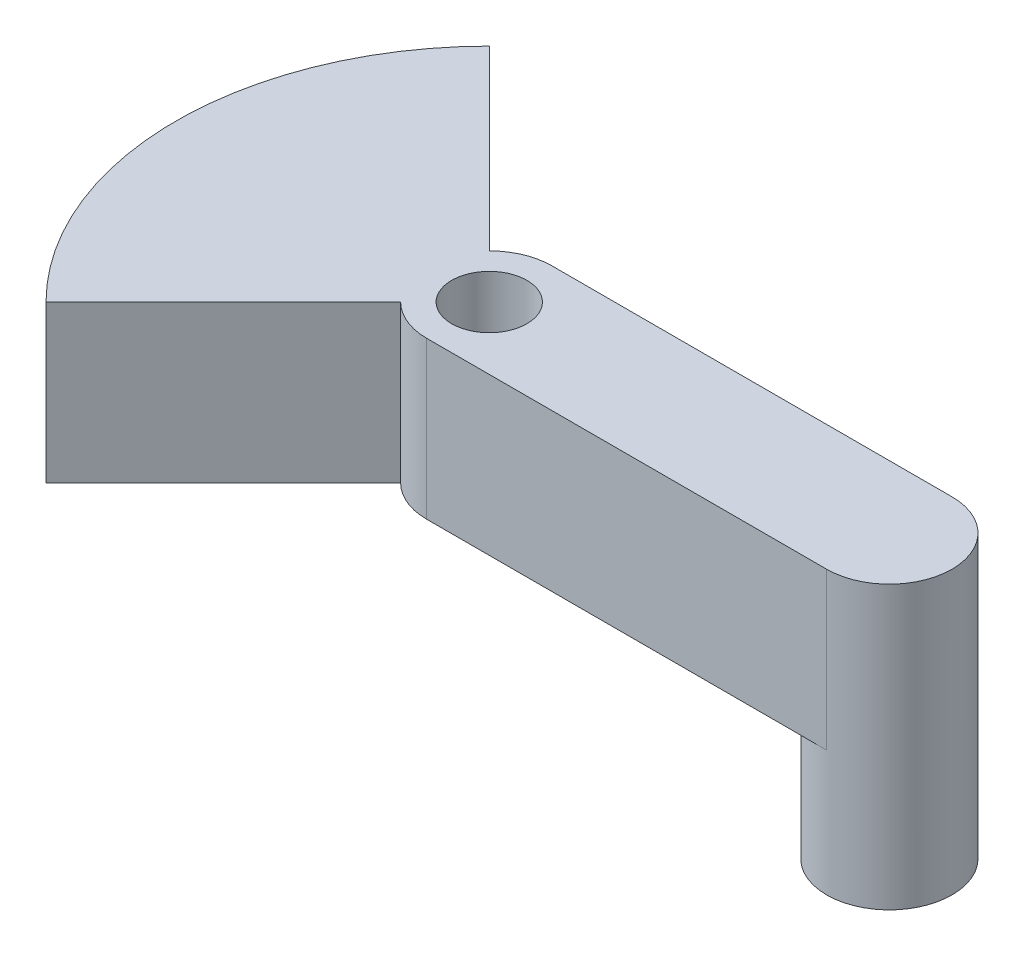
ISO-10303-21;
HEADER;
FILE_DESCRIPTION(('STEP AP214'),'2;1');
FILE_NAME('part.step','',(''),(''),'','','');
FILE_SCHEMA(('AUTOMOTIVE_DESIGN { 1 0 10303 214 1 1 1 1 }'));
ENDSEC;
DATA;
#1=APPLICATION_CONTEXT('core data for automotive mechanical design processes');
#2=APPLICATION_PROTOCOL_DEFINITION('international standard','automotive_design',2000,#1);
#3=PRODUCT_CONTEXT('',#1,'mechanical');
#4=PRODUCT('Part','Part','',(#3));
#5=PRODUCT_RELATED_PRODUCT_CATEGORY('part','',(#4));
#6=PRODUCT_DEFINITION_FORMATION('','',#4);
#7=PRODUCT_DEFINITION_CONTEXT('part definition',#1,'design');
#8=PRODUCT_DEFINITION('design','',#6,#7);
#9=PRODUCT_DEFINITION_SHAPE('','',#8);
#10=(LENGTH_UNIT() NAMED_UNIT(*) SI_UNIT(.MILLI.,.METRE.));
#11=(NAMED_UNIT(*) PLANE_ANGLE_UNIT() SI_UNIT($,.RADIAN.));
#12=(NAMED_UNIT(*) SI_UNIT($,.STERADIAN.) SOLID_ANGLE_UNIT());
#13=UNCERTAINTY_MEASURE_WITH_UNIT(LENGTH_MEASURE(1.E-05),#10,'distance_accuracy_value','');
#14=(GEOMETRIC_REPRESENTATION_CONTEXT(3) GLOBAL_UNCERTAINTY_ASSIGNED_CONTEXT((#13)) GLOBAL_UNIT_ASSIGNED_CONTEXT((#10,
#11,#12)) REPRESENTATION_CONTEXT('',''));
#15=CARTESIAN_POINT('',(0.,0.,0.));
#16=DIRECTION('',(0.,0.,1.));
#17=DIRECTION('',(1.,0.,0.));
#18=AXIS2_PLACEMENT_3D('',#15,#16,#17);
#19=CARTESIAN_POINT('',(0.,25.,0.));
#20=DIRECTION('',(0.,-1.,0.));
#21=DIRECTION('',(0.,0.,-1.));
#22=AXIS2_PLACEMENT_3D('',#19,#20,#21);
#23=CYLINDRICAL_SURFACE('',#22,10.);
#24=DIRECTION('',(0.,1.,0.));
#25=VECTOR('',#24,1.);
#26=CARTESIAN_POINT('',(-7.07106781186544,0.,7.07106781186551));
#27=LINE('',#26,#25);
#28=CARTESIAN_POINT('',(-7.07106781186544,0.,7.07106781186551));
#29=VERTEX_POINT('',#28);
#30=CARTESIAN_POINT('',(-7.07106781186544,25.,7.07106781186551));
#31=VERTEX_POINT('',#30);
#32=EDGE_CURVE('E82',#29,#31,#27,.T.);
#33=ORIENTED_EDGE('',*,*,#32,.F.);
#34=CARTESIAN_POINT('',(0.,0.,0.));
#35=DIRECTION('',(0.,1.,0.));
#36=DIRECTION('',(0.,0.,1.));
#37=AXIS2_PLACEMENT_3D('',#34,#35,#36);
#38=CIRCLE('',#37,10.);
#39=CARTESIAN_POINT('',(0.,0.,10.));
#40=VERTEX_POINT('',#39);
#41=EDGE_CURVE('E77',#29,#40,#38,.T.);
#42=ORIENTED_EDGE('',*,*,#41,.T.);
#43=DIRECTION('',(0.,-1.,0.));
#44=VECTOR('',#43,1.);
#45=CARTESIAN_POINT('',(0.,25.,10.));
#46=LINE('',#45,#44);
#47=CARTESIAN_POINT('',(0.,25.,10.));
#48=VERTEX_POINT('',#47);
#49=EDGE_CURVE('E79',#48,#40,#46,.T.);
#50=ORIENTED_EDGE('',*,*,#49,.F.);
#51=CARTESIAN_POINT('',(0.,25.,0.));
#52=DIRECTION('',(0.,1.,0.));
#53=DIRECTION('',(0.,0.,1.));
#54=AXIS2_PLACEMENT_3D('',#51,#52,#53);
#55=CIRCLE('',#54,10.);
#56=EDGE_CURVE('E58',#31,#48,#55,.T.);
#57=ORIENTED_EDGE('',*,*,#56,.F.);
#58=EDGE_LOOP('',(#33,#42,#50,#57));
#59=FACE_BOUND('',#58,.T.);
#60=ADVANCED_FACE('F43',(#59),#23,.T.);
#61=CARTESIAN_POINT('',(0.,25.,10.));
#62=DIRECTION('',(0.,0.,1.));
#63=DIRECTION('',(1.,0.,0.));
#64=AXIS2_PLACEMENT_3D('',#61,#62,#63);
#65=PLANE('',#64);
#66=DIRECTION('',(-1.,0.,0.));
#67=VECTOR('',#66,1.);
#68=CARTESIAN_POINT('',(0.,0.,10.));
#69=LINE('',#68,#67);
#70=CARTESIAN_POINT('',(63.82,0.,9.99999999999999));
#71=VERTEX_POINT('',#70);
#72=EDGE_CURVE('E93',#71,#40,#69,.T.);
#73=ORIENTED_EDGE('',*,*,#72,.F.);
#74=DIRECTION('',(0.,-1.,0.));
#75=VECTOR('',#74,1.);
#76=CARTESIAN_POINT('',(63.82,25.,9.99999999999999));
#77=LINE('',#76,#75);
#78=CARTESIAN_POINT('',(63.82,25.,9.99999999999999));
#79=VERTEX_POINT('',#78);
#80=EDGE_CURVE('E11',#79,#71,#77,.T.);
#81=ORIENTED_EDGE('',*,*,#80,.F.);
#82=DIRECTION('',(-1.,0.,0.));
#83=VECTOR('',#82,1.);
#84=CARTESIAN_POINT('',(0.,25.,10.));
#85=LINE('',#84,#83);
#86=EDGE_CURVE('E95',#79,#48,#85,.T.);
#87=ORIENTED_EDGE('',*,*,#86,.T.);
#88=ORIENTED_EDGE('',*,*,#49,.T.);
#89=EDGE_LOOP('',(#73,#81,#87,#88));
#90=FACE_BOUND('',#89,.T.);
#91=ADVANCED_FACE('F45',(#90),#65,.T.);
#92=CARTESIAN_POINT('',(0.,25.,-10.));
#93=DIRECTION('',(0.,0.,-1.));
#94=DIRECTION('',(-1.,0.,0.));
#95=AXIS2_PLACEMENT_3D('',#92,#93,#94);
#96=PLANE('',#95);
#97=DIRECTION('',(1.,0.,0.));
#98=VECTOR('',#97,1.);
#99=CARTESIAN_POINT('',(0.,0.,-10.));
#100=LINE('',#99,#98);
#101=CARTESIAN_POINT('',(0.,0.,-10.));
#102=VERTEX_POINT('',#101);
#103=CARTESIAN_POINT('',(63.82,0.,-9.99999999999999));
#104=VERTEX_POINT('',#103);
#105=EDGE_CURVE('E106',#102,#104,#100,.T.);
#106=ORIENTED_EDGE('',*,*,#105,.F.);
#107=DIRECTION('',(0.,-1.,0.));
#108=VECTOR('',#107,1.);
#109=CARTESIAN_POINT('',(0.,25.,-10.));
#110=LINE('',#109,#108);
#111=CARTESIAN_POINT('',(0.,25.,-10.));
#112=VERTEX_POINT('',#111);
#113=EDGE_CURVE('E96',#112,#102,#110,.T.);
#114=ORIENTED_EDGE('',*,*,#113,.F.);
#115=DIRECTION('',(1.,0.,0.));
#116=VECTOR('',#115,1.);
#117=CARTESIAN_POINT('',(0.,25.,-10.));
#118=LINE('',#117,#116);
#119=CARTESIAN_POINT('',(63.82,25.,-9.99999999999999));
#120=VERTEX_POINT('',#119);
#121=EDGE_CURVE('E130',#112,#120,#118,.T.);
#122=ORIENTED_EDGE('',*,*,#121,.T.);
#123=DIRECTION('',(0.,-1.,0.));
#124=VECTOR('',#123,1.);
#125=CARTESIAN_POINT('',(63.82,25.,-9.99999999999999));
#126=LINE('',#125,#124);
#127=EDGE_CURVE('E51',#120,#104,#126,.T.);
#128=ORIENTED_EDGE('',*,*,#127,.T.);
#129=EDGE_LOOP('',(#106,#114,#122,#128));
#130=FACE_BOUND('',#129,.T.);
#131=ADVANCED_FACE('F127',(#130),#96,.T.);
#132=CARTESIAN_POINT('',(0.,25.,0.));
#133=DIRECTION('',(0.,-1.,0.));
#134=DIRECTION('',(0.,0.,-1.));
#135=AXIS2_PLACEMENT_3D('',#132,#133,#134);
#136=CYLINDRICAL_SURFACE('',#135,10.);
#137=CARTESIAN_POINT('',(0.,0.,0.));
#138=DIRECTION('',(0.,1.,0.));
#139=DIRECTION('',(0.,0.,1.));
#140=AXIS2_PLACEMENT_3D('',#137,#138,#139);
#141=CIRCLE('',#140,10.);
#142=CARTESIAN_POINT('',(-7.07106781186551,0.,-7.07106781186544));
#143=VERTEX_POINT('',#142);
#144=EDGE_CURVE('E115',#102,#143,#141,.T.);
#145=ORIENTED_EDGE('',*,*,#144,.T.);
#146=DIRECTION('',(0.,1.,0.));
#147=VECTOR('',#146,1.);
#148=CARTESIAN_POINT('',(-7.07106781186551,0.,-7.07106781186544));
#149=LINE('',#148,#147);
#150=CARTESIAN_POINT('',(-7.07106781186551,25.,-7.07106781186544));
#151=VERTEX_POINT('',#150);
#152=EDGE_CURVE('E146',#143,#151,#149,.T.);
#153=ORIENTED_EDGE('',*,*,#152,.T.);
#154=CARTESIAN_POINT('',(0.,25.,0.));
#155=DIRECTION('',(0.,1.,0.));
#156=DIRECTION('',(0.,0.,1.));
#157=AXIS2_PLACEMENT_3D('',#154,#155,#156);
#158=CIRCLE('',#157,10.);
#159=EDGE_CURVE('E193',#112,#151,#158,.T.);
#160=ORIENTED_EDGE('',*,*,#159,.F.);
#161=ORIENTED_EDGE('',*,*,#113,.T.);
#162=EDGE_LOOP('',(#145,#153,#160,#161));
#163=FACE_BOUND('',#162,.T.);
#164=ADVANCED_FACE('F142',(#163),#136,.T.);
#165=CARTESIAN_POINT('',(0.,25.,0.));
#166=DIRECTION('',(0.,-1.,0.));
#167=DIRECTION('',(0.,0.,-1.));
#168=AXIS2_PLACEMENT_3D('',#165,#166,#167);
#169=CYLINDRICAL_SURFACE('',#168,50.);
#170=CARTESIAN_POINT('',(0.,0.,0.));
#171=DIRECTION('',(0.,1.,0.));
#172=DIRECTION('',(0.,0.,1.));
#173=AXIS2_PLACEMENT_3D('',#170,#171,#172);
#174=CIRCLE('',#173,50.);
#175=CARTESIAN_POINT('',(-35.3553390593276,0.,-35.3553390593272));
#176=VERTEX_POINT('',#175);
#177=CARTESIAN_POINT('',(-35.3553390593272,0.,35.3553390593276));
#178=VERTEX_POINT('',#177);
#179=EDGE_CURVE('E88',#176,#178,#174,.T.);
#180=ORIENTED_EDGE('',*,*,#179,.T.);
#181=DIRECTION('',(0.,1.,0.));
#182=VECTOR('',#181,1.);
#183=CARTESIAN_POINT('',(-35.3553390593272,0.,35.3553390593276));
#184=LINE('',#183,#182);
#185=CARTESIAN_POINT('',(-35.3553390593272,25.,35.3553390593276));
#186=VERTEX_POINT('',#185);
#187=EDGE_CURVE('E171',#178,#186,#184,.T.);
#188=ORIENTED_EDGE('',*,*,#187,.T.);
#189=CARTESIAN_POINT('',(0.,25.,0.));
#190=DIRECTION('',(0.,1.,0.));
#191=DIRECTION('',(0.,0.,1.));
#192=AXIS2_PLACEMENT_3D('',#189,#190,#191);
#193=CIRCLE('',#192,50.);
#194=CARTESIAN_POINT('',(-35.3553390593276,25.,-35.3553390593272));
#195=VERTEX_POINT('',#194);
#196=EDGE_CURVE('E195',#195,#186,#193,.T.);
#197=ORIENTED_EDGE('',*,*,#196,.F.);
#198=DIRECTION('',(0.,1.,0.));
#199=VECTOR('',#198,1.);
#200=CARTESIAN_POINT('',(-35.3553390593276,0.,-35.3553390593272));
#201=LINE('',#200,#199);
#202=EDGE_CURVE('E174',#176,#195,#201,.T.);
#203=ORIENTED_EDGE('',*,*,#202,.F.);
#204=EDGE_LOOP('',(#180,#188,#197,#203));
#205=FACE_BOUND('',#204,.T.);
#206=ADVANCED_FACE('F169',(#205),#169,.T.);
#207=CARTESIAN_POINT('',(0.,25.,0.));
#208=DIRECTION('',(0.,-1.,0.));
#209=DIRECTION('',(0.,0.,-1.));
#210=AXIS2_PLACEMENT_3D('',#207,#208,#209);
#211=CYLINDRICAL_SURFACE('',#210,6.);
#212=CARTESIAN_POINT('',(0.,25.,0.));
#213=DIRECTION('',(0.,1.,0.));
#214=DIRECTION('',(0.,0.,1.));
#215=AXIS2_PLACEMENT_3D('',#212,#213,#214);
#216=CIRCLE('',#215,6.);
#217=CARTESIAN_POINT('',(0.,25.,6.));
#218=VERTEX_POINT('',#217);
#219=EDGE_CURVE('E97',#218,#218,#216,.T.);
#220=ORIENTED_EDGE('',*,*,#219,.T.);
#221=EDGE_LOOP('',(#220));
#222=FACE_BOUND('',#221,.T.);
#223=CARTESIAN_POINT('',(0.,0.,0.));
#224=DIRECTION('',(0.,1.,0.));
#225=DIRECTION('',(0.,0.,1.));
#226=AXIS2_PLACEMENT_3D('',#223,#224,#225);
#227=CIRCLE('',#226,6.);
#228=CARTESIAN_POINT('',(0.,0.,6.));
#229=VERTEX_POINT('',#228);
#230=EDGE_CURVE('E87',#229,#229,#227,.T.);
#231=ORIENTED_EDGE('',*,*,#230,.F.);
#232=EDGE_LOOP('',(#231));
#233=FACE_BOUND('',#232,.T.);
#234=ADVANCED_FACE('F199',(#222,#233),#211,.F.);
#235=CARTESIAN_POINT('',(0.,25.,0.));
#236=DIRECTION('',(0.,1.,0.));
#237=DIRECTION('',(0.,0.,1.));
#238=AXIS2_PLACEMENT_3D('',#235,#236,#237);
#239=PLANE('',#238);
#240=ORIENTED_EDGE('',*,*,#86,.F.);
#241=CARTESIAN_POINT('',(63.82,25.,0.));
#242=DIRECTION('',(0.,1.,0.));
#243=DIRECTION('',(0.,0.,1.));
#244=AXIS2_PLACEMENT_3D('',#241,#242,#243);
#245=CIRCLE('',#244,9.99999999999999);
#246=EDGE_CURVE('E109',#79,#120,#245,.T.);
#247=ORIENTED_EDGE('',*,*,#246,.T.);
#248=ORIENTED_EDGE('',*,*,#121,.F.);
#249=ORIENTED_EDGE('',*,*,#159,.T.);
#250=DIRECTION('',(-0.707106781186551,0.,-0.707106781186544));
#251=VECTOR('',#250,1.);
#252=CARTESIAN_POINT('',(0.,25.,0.));
#253=LINE('',#252,#251);
#254=EDGE_CURVE('E185',#151,#195,#253,.T.);
#255=ORIENTED_EDGE('',*,*,#254,.T.);
#256=ORIENTED_EDGE('',*,*,#196,.T.);
#257=DIRECTION('',(-0.707106781186544,0.,0.707106781186551));
#258=VECTOR('',#257,1.);
#259=CARTESIAN_POINT('',(0.,25.,0.));
#260=LINE('',#259,#258);
#261=EDGE_CURVE('E177',#31,#186,#260,.T.);
#262=ORIENTED_EDGE('',*,*,#261,.F.);
#263=ORIENTED_EDGE('',*,*,#56,.T.);
#264=EDGE_LOOP('',(#240,#247,#248,#249,#255,#256,#262,#263));
#265=FACE_BOUND('',#264,.T.);
#266=ORIENTED_EDGE('',*,*,#219,.F.);
#267=EDGE_LOOP('',(#266));
#268=FACE_BOUND('',#267,.T.);
#269=ADVANCED_FACE('F202',(#265,#268),#239,.T.);
#270=CARTESIAN_POINT('',(0.,0.,0.));
#271=DIRECTION('',(0.,1.,0.));
#272=DIRECTION('',(0.,0.,1.));
#273=AXIS2_PLACEMENT_3D('',#270,#271,#272);
#274=PLANE('',#273);
#275=ORIENTED_EDGE('',*,*,#72,.T.);
#276=ORIENTED_EDGE('',*,*,#41,.F.);
#277=DIRECTION('',(-0.707106781186544,0.,0.707106781186551));
#278=VECTOR('',#277,1.);
#279=CARTESIAN_POINT('',(0.,0.,0.));
#280=LINE('',#279,#278);
#281=EDGE_CURVE('E175',#29,#178,#280,.T.);
#282=ORIENTED_EDGE('',*,*,#281,.T.);
#283=ORIENTED_EDGE('',*,*,#179,.F.);
#284=DIRECTION('',(-0.707106781186551,0.,-0.707106781186544));
#285=VECTOR('',#284,1.);
#286=CARTESIAN_POINT('',(0.,0.,0.));
#287=LINE('',#286,#285);
#288=EDGE_CURVE('E139',#143,#176,#287,.T.);
#289=ORIENTED_EDGE('',*,*,#288,.F.);
#290=ORIENTED_EDGE('',*,*,#144,.F.);
#291=ORIENTED_EDGE('',*,*,#105,.T.);
#292=CARTESIAN_POINT('',(63.82,0.,0.));
#293=DIRECTION('',(0.,1.,0.));
#294=DIRECTION('',(0.,0.,1.));
#295=AXIS2_PLACEMENT_3D('',#292,#293,#294);
#296=CIRCLE('',#295,9.99999999999999);
#297=EDGE_CURVE('E103',#104,#71,#296,.T.);
#298=ORIENTED_EDGE('',*,*,#297,.T.);
#299=EDGE_LOOP('',(#275,#276,#282,#283,#289,#290,#291,#298));
#300=FACE_BOUND('',#299,.T.);
#301=ORIENTED_EDGE('',*,*,#230,.T.);
#302=EDGE_LOOP('',(#301));
#303=FACE_BOUND('',#302,.T.);
#304=ADVANCED_FACE('F99',(#300,#303),#274,.F.);
#305=CARTESIAN_POINT('',(63.82,-20.,0.));
#306=DIRECTION('',(0.,1.,0.));
#307=DIRECTION('',(0.,0.,1.));
#308=AXIS2_PLACEMENT_3D('',#305,#306,#307);
#309=CYLINDRICAL_SURFACE('',#308,9.99999999999999);
#310=CARTESIAN_POINT('',(63.82,-20.,0.));
#311=DIRECTION('',(0.,1.,0.));
#312=DIRECTION('',(0.,0.,1.));
#313=AXIS2_PLACEMENT_3D('',#310,#311,#312);
#314=CIRCLE('',#313,9.99999999999999);
#315=CARTESIAN_POINT('',(63.82,-20.,9.99999999999999));
#316=VERTEX_POINT('',#315);
#317=EDGE_CURVE('E104',#316,#316,#314,.T.);
#318=ORIENTED_EDGE('',*,*,#317,.T.);
#319=EDGE_LOOP('',(#318));
#320=FACE_BOUND('',#319,.T.);
#321=ORIENTED_EDGE('',*,*,#80,.T.);
#322=ORIENTED_EDGE('',*,*,#297,.F.);
#323=ORIENTED_EDGE('',*,*,#127,.F.);
#324=ORIENTED_EDGE('',*,*,#246,.F.);
#325=EDGE_LOOP('',(#321,#322,#323,#324));
#326=FACE_BOUND('',#325,.T.);
#327=ADVANCED_FACE('F207',(#320,#326),#309,.T.);
#328=CARTESIAN_POINT('',(0.,-20.,0.));
#329=DIRECTION('',(0.,1.,0.));
#330=DIRECTION('',(0.,0.,1.));
#331=AXIS2_PLACEMENT_3D('',#328,#329,#330);
#332=PLANE('',#331);
#333=ORIENTED_EDGE('',*,*,#317,.F.);
#334=EDGE_LOOP('',(#333));
#335=FACE_BOUND('',#334,.T.);
#336=ADVANCED_FACE('F235',(#335),#332,.F.);
#337=CARTESIAN_POINT('',(0.,0.,0.));
#338=DIRECTION('',(0.707106781186544,0.,-0.707106781186551));
#339=DIRECTION('',(-0.707106781186551,0.,-0.707106781186544));
#340=AXIS2_PLACEMENT_3D('',#337,#338,#339);
#341=PLANE('',#340);
#342=ORIENTED_EDGE('',*,*,#254,.F.);
#343=ORIENTED_EDGE('',*,*,#152,.F.);
#344=ORIENTED_EDGE('',*,*,#288,.T.);
#345=ORIENTED_EDGE('',*,*,#202,.T.);
#346=EDGE_LOOP('',(#342,#343,#344,#345));
#347=FACE_BOUND('',#346,.T.);
#348=ADVANCED_FACE('F244',(#347),#341,.T.);
#349=CARTESIAN_POINT('',(0.,0.,0.));
#350=DIRECTION('',(-0.707106781186551,0.,-0.707106781186544));
#351=DIRECTION('',(-0.707106781186544,0.,0.707106781186551));
#352=AXIS2_PLACEMENT_3D('',#349,#350,#351);
#353=PLANE('',#352);
#354=ORIENTED_EDGE('',*,*,#261,.T.);
#355=ORIENTED_EDGE('',*,*,#187,.F.);
#356=ORIENTED_EDGE('',*,*,#281,.F.);
#357=ORIENTED_EDGE('',*,*,#32,.T.);
#358=EDGE_LOOP('',(#354,#355,#356,#357));
#359=FACE_BOUND('',#358,.T.);
#360=ADVANCED_FACE('F179',(#359),#353,.F.);
#361=CLOSED_SHELL('',(#60,#91,#131,#164,#206,#234,#269,#304,#327,#336,#348,#360));
#362=MANIFOLD_SOLID_BREP('B2',#361);
#363=ADVANCED_BREP_SHAPE_REPRESENTATION('',(#18,#362),#14);
#364=SHAPE_DEFINITION_REPRESENTATION(#9,#363);
ENDSEC;
END-ISO-10303-21;
